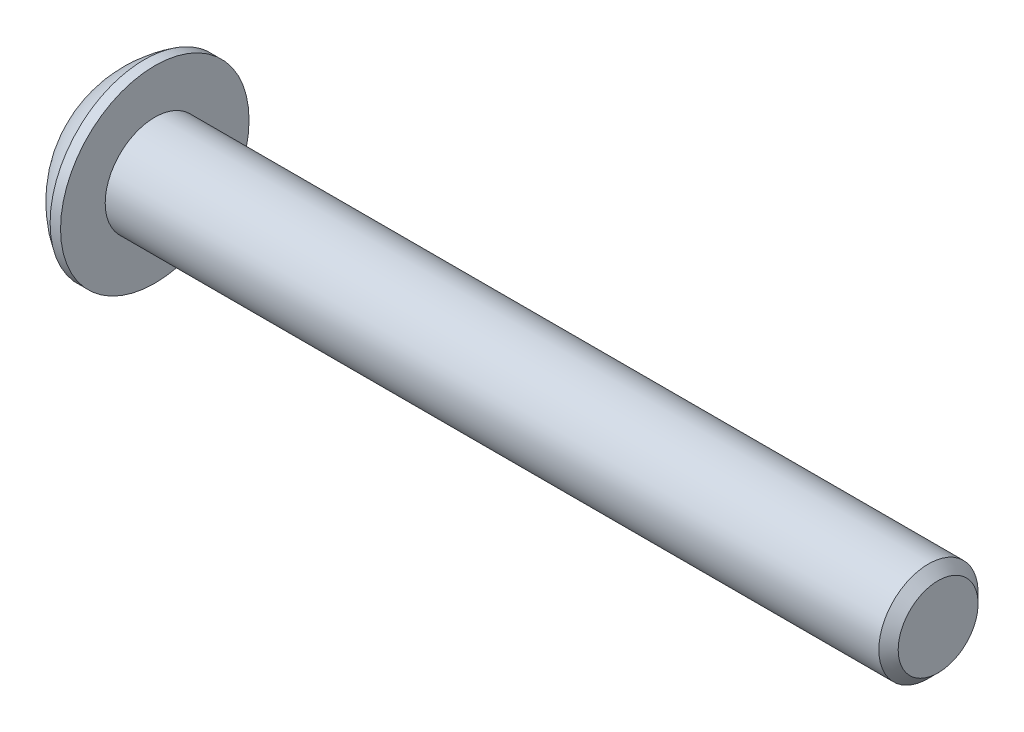
ISO-10303-21;
HEADER;
FILE_DESCRIPTION(('STEP AP214'),'2;1');
FILE_NAME('part.step','',(''),(''),'','','');
FILE_SCHEMA(('AUTOMOTIVE_DESIGN { 1 0 10303 214 1 1 1 1 }'));
ENDSEC;
DATA;
#1=APPLICATION_CONTEXT('core data for automotive mechanical design processes');
#2=APPLICATION_PROTOCOL_DEFINITION('international standard','automotive_design',2000,#1);
#3=PRODUCT_CONTEXT('',#1,'mechanical');
#4=PRODUCT('Part','Part','',(#3));
#5=PRODUCT_RELATED_PRODUCT_CATEGORY('part','',(#4));
#6=PRODUCT_DEFINITION_FORMATION('','',#4);
#7=PRODUCT_DEFINITION_CONTEXT('part definition',#1,'design');
#8=PRODUCT_DEFINITION('design','',#6,#7);
#9=PRODUCT_DEFINITION_SHAPE('','',#8);
#10=(LENGTH_UNIT() NAMED_UNIT(*) SI_UNIT(.MILLI.,.METRE.));
#11=(NAMED_UNIT(*) PLANE_ANGLE_UNIT() SI_UNIT($,.RADIAN.));
#12=(NAMED_UNIT(*) SI_UNIT($,.STERADIAN.) SOLID_ANGLE_UNIT());
#13=UNCERTAINTY_MEASURE_WITH_UNIT(LENGTH_MEASURE(1.E-05),#10,'distance_accuracy_value','');
#14=(GEOMETRIC_REPRESENTATION_CONTEXT(3) GLOBAL_UNCERTAINTY_ASSIGNED_CONTEXT((#13)) GLOBAL_UNIT_ASSIGNED_CONTEXT((#10,
#11,#12)) REPRESENTATION_CONTEXT('',''));
#15=CARTESIAN_POINT('',(0.,0.,0.));
#16=DIRECTION('',(0.,0.,1.));
#17=DIRECTION('',(1.,0.,0.));
#18=AXIS2_PLACEMENT_3D('',#15,#16,#17);
#19=CARTESIAN_POINT('',(1.77800000000017,0.,0.));
#20=DIRECTION('',(-1.,0.,0.));
#21=DIRECTION('',(0.,0.,1.));
#22=AXIS2_PLACEMENT_3D('',#19,#20,#21);
#23=CONICAL_SURFACE('',#22,1.58749999999985,1.04719755119662);
#24=CARTESIAN_POINT('',(2.69454355233856,0.,0.));
#25=VERTEX_POINT('',#24);
#26=VERTEX_LOOP('',#25);
#27=FACE_BOUND('',#26,.T.);
#28=CARTESIAN_POINT('',(1.77800000000017,0.,0.));
#29=DIRECTION('',(-1.,0.,0.));
#30=DIRECTION('',(0.,0.,1.));
#31=AXIS2_PLACEMENT_3D('',#28,#29,#30);
#32=CIRCLE('',#31,1.58749999999985);
#33=CARTESIAN_POINT('',(1.77800000000008,0.,1.58749999999993));
#34=VERTEX_POINT('',#33);
#35=CARTESIAN_POINT('',(1.77800000000008,-1.37481532850773,0.793749999999963));
#36=VERTEX_POINT('',#35);
#37=EDGE_CURVE('E20',#34,#36,#32,.F.);
#38=ORIENTED_EDGE('',*,*,#37,.F.);
#39=CARTESIAN_POINT('',(1.77800000000017,0.,0.));
#40=DIRECTION('',(-1.,0.,0.));
#41=DIRECTION('',(0.,0.,1.));
#42=AXIS2_PLACEMENT_3D('',#39,#40,#41);
#43=CIRCLE('',#42,1.58749999999985);
#44=CARTESIAN_POINT('',(1.77800000000008,1.37481532850773,0.793749999999963));
#45=VERTEX_POINT('',#44);
#46=EDGE_CURVE('E90',#45,#34,#43,.F.);
#47=ORIENTED_EDGE('',*,*,#46,.F.);
#48=CARTESIAN_POINT('',(1.77800000000017,0.,0.));
#49=DIRECTION('',(-1.,0.,0.));
#50=DIRECTION('',(0.,0.,1.));
#51=AXIS2_PLACEMENT_3D('',#48,#49,#50);
#52=CIRCLE('',#51,1.58749999999985);
#53=CARTESIAN_POINT('',(1.77800000000008,1.37481532850773,-0.793749999999964));
#54=VERTEX_POINT('',#53);
#55=EDGE_CURVE('E106',#54,#45,#52,.F.);
#56=ORIENTED_EDGE('',*,*,#55,.F.);
#57=CARTESIAN_POINT('',(1.77800000000017,0.,0.));
#58=DIRECTION('',(-1.,0.,0.));
#59=DIRECTION('',(0.,0.,1.));
#60=AXIS2_PLACEMENT_3D('',#57,#58,#59);
#61=CIRCLE('',#60,1.58749999999985);
#62=CARTESIAN_POINT('',(1.77800000000008,2.13833679173112E-12,-1.58749999999993));
#63=VERTEX_POINT('',#62);
#64=EDGE_CURVE('E445',#63,#54,#61,.F.);
#65=ORIENTED_EDGE('',*,*,#64,.F.);
#66=CARTESIAN_POINT('',(1.77800000000017,0.,0.));
#67=DIRECTION('',(-1.,0.,0.));
#68=DIRECTION('',(0.,0.,1.));
#69=AXIS2_PLACEMENT_3D('',#66,#67,#68);
#70=CIRCLE('',#69,1.58749999999985);
#71=CARTESIAN_POINT('',(1.77800000000008,-1.37481532850773,-0.793749999999964));
#72=VERTEX_POINT('',#71);
#73=EDGE_CURVE('E447',#72,#63,#70,.F.);
#74=ORIENTED_EDGE('',*,*,#73,.F.);
#75=CARTESIAN_POINT('',(1.77800000000017,0.,0.));
#76=DIRECTION('',(-1.,0.,0.));
#77=DIRECTION('',(0.,0.,1.));
#78=AXIS2_PLACEMENT_3D('',#75,#76,#77);
#79=CIRCLE('',#78,1.58749999999985);
#80=EDGE_CURVE('E93',#36,#72,#79,.F.);
#81=ORIENTED_EDGE('',*,*,#80,.F.);
#82=EDGE_LOOP('',(#38,#47,#56,#65,#74,#81));
#83=FACE_BOUND('',#82,.T.);
#84=ADVANCED_FACE('F17',(#27,#83),#23,.F.);
#85=CARTESIAN_POINT('',(1.778,0.,3.175));
#86=DIRECTION('',(-1.,0.,0.));
#87=DIRECTION('',(0.,0.,1.));
#88=AXIS2_PLACEMENT_3D('',#85,#86,#87);
#89=PLANE('',#88);
#90=DIRECTION('',(0.,1.,0.));
#91=VECTOR('',#90,1.);
#92=CARTESIAN_POINT('',(1.778,-0.91654355233853,1.5875));
#93=LINE('',#92,#91);
#94=CARTESIAN_POINT('',(1.778,-0.916543552338529,1.5875));
#95=VERTEX_POINT('',#94);
#96=EDGE_CURVE('E109',#34,#95,#93,.F.);
#97=ORIENTED_EDGE('',*,*,#96,.F.);
#98=ORIENTED_EDGE('',*,*,#37,.T.);
#99=DIRECTION('',(0.,0.5,0.866025403784439));
#100=VECTOR('',#99,1.);
#101=CARTESIAN_POINT('',(1.778,-1.83308710467706,0.));
#102=LINE('',#101,#100);
#103=EDGE_CURVE('E111',#95,#36,#102,.F.);
#104=ORIENTED_EDGE('',*,*,#103,.F.);
#105=EDGE_LOOP('',(#97,#98,#104));
#106=FACE_BOUND('',#105,.T.);
#107=ADVANCED_FACE('F110',(#106),#89,.T.);
#108=CARTESIAN_POINT('',(1.778,0.,3.175));
#109=DIRECTION('',(-1.,0.,0.));
#110=DIRECTION('',(0.,0.,1.));
#111=AXIS2_PLACEMENT_3D('',#108,#109,#110);
#112=PLANE('',#111);
#113=DIRECTION('',(0.,0.5,0.866025403784439));
#114=VECTOR('',#113,1.);
#115=CARTESIAN_POINT('',(1.778,-1.83308710467706,0.));
#116=LINE('',#115,#114);
#117=CARTESIAN_POINT('',(1.778,-1.83308710467706,0.));
#118=VERTEX_POINT('',#117);
#119=EDGE_CURVE('E171',#36,#118,#116,.F.);
#120=ORIENTED_EDGE('',*,*,#119,.F.);
#121=ORIENTED_EDGE('',*,*,#80,.T.);
#122=DIRECTION('',(0.,-0.5,0.866025403784439));
#123=VECTOR('',#122,1.);
#124=CARTESIAN_POINT('',(1.778,-0.91654355233853,-1.5875));
#125=LINE('',#124,#123);
#126=EDGE_CURVE('E159',#118,#72,#125,.F.);
#127=ORIENTED_EDGE('',*,*,#126,.F.);
#128=EDGE_LOOP('',(#120,#121,#127));
#129=FACE_BOUND('',#128,.T.);
#130=ADVANCED_FACE('F249',(#129),#112,.T.);
#131=CARTESIAN_POINT('',(1.778,0.,3.175));
#132=DIRECTION('',(-1.,0.,0.));
#133=DIRECTION('',(0.,0.,1.));
#134=AXIS2_PLACEMENT_3D('',#131,#132,#133);
#135=PLANE('',#134);
#136=DIRECTION('',(0.,-0.5,0.866025403784439));
#137=VECTOR('',#136,1.);
#138=CARTESIAN_POINT('',(1.778,-0.91654355233853,-1.5875));
#139=LINE('',#138,#137);
#140=CARTESIAN_POINT('',(1.778,-0.91654355233853,-1.5875));
#141=VERTEX_POINT('',#140);
#142=EDGE_CURVE('E156',#72,#141,#139,.F.);
#143=ORIENTED_EDGE('',*,*,#142,.F.);
#144=ORIENTED_EDGE('',*,*,#73,.T.);
#145=DIRECTION('',(0.,1.,0.));
#146=VECTOR('',#145,1.);
#147=CARTESIAN_POINT('',(1.778,0.916543552338532,-1.5875));
#148=LINE('',#147,#146);
#149=EDGE_CURVE('E143',#141,#63,#148,.T.);
#150=ORIENTED_EDGE('',*,*,#149,.F.);
#151=EDGE_LOOP('',(#143,#144,#150));
#152=FACE_BOUND('',#151,.T.);
#153=ADVANCED_FACE('F245',(#152),#135,.T.);
#154=CARTESIAN_POINT('',(1.778,0.,3.175));
#155=DIRECTION('',(-1.,0.,0.));
#156=DIRECTION('',(0.,0.,1.));
#157=AXIS2_PLACEMENT_3D('',#154,#155,#156);
#158=PLANE('',#157);
#159=DIRECTION('',(0.,1.,0.));
#160=VECTOR('',#159,1.);
#161=CARTESIAN_POINT('',(1.778,0.916543552338532,-1.5875));
#162=LINE('',#161,#160);
#163=CARTESIAN_POINT('',(1.778,0.916543552338532,-1.5875));
#164=VERTEX_POINT('',#163);
#165=EDGE_CURVE('E140',#63,#164,#162,.T.);
#166=ORIENTED_EDGE('',*,*,#165,.F.);
#167=ORIENTED_EDGE('',*,*,#64,.T.);
#168=DIRECTION('',(0.,-0.5,-0.866025403784439));
#169=VECTOR('',#168,1.);
#170=CARTESIAN_POINT('',(1.778,1.83308710467706,0.));
#171=LINE('',#170,#169);
#172=EDGE_CURVE('E128',#164,#54,#171,.F.);
#173=ORIENTED_EDGE('',*,*,#172,.F.);
#174=EDGE_LOOP('',(#166,#167,#173));
#175=FACE_BOUND('',#174,.T.);
#176=ADVANCED_FACE('F241',(#175),#158,.T.);
#177=CARTESIAN_POINT('',(1.778,0.,3.175));
#178=DIRECTION('',(-1.,0.,0.));
#179=DIRECTION('',(0.,0.,1.));
#180=AXIS2_PLACEMENT_3D('',#177,#178,#179);
#181=PLANE('',#180);
#182=DIRECTION('',(0.,-0.5,-0.866025403784439));
#183=VECTOR('',#182,1.);
#184=CARTESIAN_POINT('',(1.778,1.83308710467706,0.));
#185=LINE('',#184,#183);
#186=CARTESIAN_POINT('',(1.778,1.83308710467706,0.));
#187=VERTEX_POINT('',#186);
#188=EDGE_CURVE('E125',#54,#187,#185,.F.);
#189=ORIENTED_EDGE('',*,*,#188,.F.);
#190=ORIENTED_EDGE('',*,*,#55,.T.);
#191=DIRECTION('',(0.,0.5,-0.866025403784439));
#192=VECTOR('',#191,1.);
#193=CARTESIAN_POINT('',(1.778,0.916543552338532,1.5875));
#194=LINE('',#193,#192);
#195=EDGE_CURVE('E148',#187,#45,#194,.F.);
#196=ORIENTED_EDGE('',*,*,#195,.F.);
#197=EDGE_LOOP('',(#189,#190,#196));
#198=FACE_BOUND('',#197,.T.);
#199=ADVANCED_FACE('F238',(#198),#181,.T.);
#200=CARTESIAN_POINT('',(1.778,0.,3.175));
#201=DIRECTION('',(-1.,0.,0.));
#202=DIRECTION('',(0.,0.,1.));
#203=AXIS2_PLACEMENT_3D('',#200,#201,#202);
#204=PLANE('',#203);
#205=DIRECTION('',(0.,0.5,-0.866025403784439));
#206=VECTOR('',#205,1.);
#207=CARTESIAN_POINT('',(1.778,0.916543552338532,1.5875));
#208=LINE('',#207,#206);
#209=CARTESIAN_POINT('',(1.778,0.916543552338532,1.5875));
#210=VERTEX_POINT('',#209);
#211=EDGE_CURVE('E104',#45,#210,#208,.F.);
#212=ORIENTED_EDGE('',*,*,#211,.F.);
#213=ORIENTED_EDGE('',*,*,#46,.T.);
#214=DIRECTION('',(0.,1.,0.));
#215=VECTOR('',#214,1.);
#216=CARTESIAN_POINT('',(1.778,-0.91654355233853,1.5875));
#217=LINE('',#216,#215);
#218=EDGE_CURVE('E101',#210,#34,#217,.F.);
#219=ORIENTED_EDGE('',*,*,#218,.F.);
#220=EDGE_LOOP('',(#212,#213,#219));
#221=FACE_BOUND('',#220,.T.);
#222=ADVANCED_FACE('F99',(#221),#204,.T.);
#223=CARTESIAN_POINT('',(1.778,-0.91654355233853,1.5875));
#224=DIRECTION('',(0.,0.,-1.));
#225=DIRECTION('',(0.,1.,0.));
#226=AXIS2_PLACEMENT_3D('',#223,#224,#225);
#227=PLANE('',#226);
#228=DIRECTION('',(0.,1.,0.));
#229=VECTOR('',#228,1.);
#230=CARTESIAN_POINT('',(0.,0.,1.5875));
#231=LINE('',#230,#229);
#232=CARTESIAN_POINT('',(0.,0.916543552338532,1.5875));
#233=VERTEX_POINT('',#232);
#234=CARTESIAN_POINT('',(0.,-0.91654355233853,1.5875));
#235=VERTEX_POINT('',#234);
#236=EDGE_CURVE('E132',#233,#235,#231,.F.);
#237=ORIENTED_EDGE('',*,*,#236,.F.);
#238=DIRECTION('',(1.,0.,0.));
#239=VECTOR('',#238,1.);
#240=CARTESIAN_POINT('',(1.778,0.916543552338532,1.5875));
#241=LINE('',#240,#239);
#242=EDGE_CURVE('E117',#210,#233,#241,.F.);
#243=ORIENTED_EDGE('',*,*,#242,.F.);
#244=ORIENTED_EDGE('',*,*,#218,.T.);
#245=ORIENTED_EDGE('',*,*,#96,.T.);
#246=DIRECTION('',(1.,0.,0.));
#247=VECTOR('',#246,1.);
#248=CARTESIAN_POINT('',(1.778,-0.916543552338529,1.5875));
#249=LINE('',#248,#247);
#250=EDGE_CURVE('E168',#235,#95,#249,.T.);
#251=ORIENTED_EDGE('',*,*,#250,.F.);
#252=EDGE_LOOP('',(#237,#243,#244,#245,#251));
#253=FACE_BOUND('',#252,.T.);
#254=ADVANCED_FACE('F115',(#253),#227,.T.);
#255=CARTESIAN_POINT('',(1.778,-1.83308710467706,0.));
#256=DIRECTION('',(0.,0.866025403784439,-0.5));
#257=DIRECTION('',(0.,0.5,0.866025403784439));
#258=AXIS2_PLACEMENT_3D('',#255,#256,#257);
#259=PLANE('',#258);
#260=DIRECTION('',(0.,-0.5,-0.866025403784439));
#261=VECTOR('',#260,1.);
#262=CARTESIAN_POINT('',(0.,-0.91654355233853,1.5875));
#263=LINE('',#262,#261);
#264=CARTESIAN_POINT('',(0.,-1.83308710467706,0.));
#265=VERTEX_POINT('',#264);
#266=EDGE_CURVE('E431',#235,#265,#263,.T.);
#267=ORIENTED_EDGE('',*,*,#266,.F.);
#268=ORIENTED_EDGE('',*,*,#250,.T.);
#269=ORIENTED_EDGE('',*,*,#103,.T.);
#270=ORIENTED_EDGE('',*,*,#119,.T.);
#271=DIRECTION('',(1.,0.,0.));
#272=VECTOR('',#271,1.);
#273=CARTESIAN_POINT('',(1.778,-1.83308710467706,0.));
#274=LINE('',#273,#272);
#275=EDGE_CURVE('E153',#265,#118,#274,.T.);
#276=ORIENTED_EDGE('',*,*,#275,.F.);
#277=EDGE_LOOP('',(#267,#268,#269,#270,#276));
#278=FACE_BOUND('',#277,.T.);
#279=ADVANCED_FACE('F229',(#278),#259,.T.);
#280=CARTESIAN_POINT('',(1.778,-0.91654355233853,-1.5875));
#281=DIRECTION('',(0.,0.866025403784439,0.5));
#282=DIRECTION('',(0.,-0.5,0.866025403784439));
#283=AXIS2_PLACEMENT_3D('',#280,#281,#282);
#284=PLANE('',#283);
#285=DIRECTION('',(0.,0.5,-0.866025403784439));
#286=VECTOR('',#285,1.);
#287=CARTESIAN_POINT('',(0.,-1.83308710467706,0.));
#288=LINE('',#287,#286);
#289=CARTESIAN_POINT('',(0.,-0.91654355233853,-1.5875));
#290=VERTEX_POINT('',#289);
#291=EDGE_CURVE('E428',#265,#290,#288,.T.);
#292=ORIENTED_EDGE('',*,*,#291,.F.);
#293=ORIENTED_EDGE('',*,*,#275,.T.);
#294=ORIENTED_EDGE('',*,*,#126,.T.);
#295=ORIENTED_EDGE('',*,*,#142,.T.);
#296=DIRECTION('',(1.,0.,0.));
#297=VECTOR('',#296,1.);
#298=CARTESIAN_POINT('',(1.778,-0.91654355233853,-1.5875));
#299=LINE('',#298,#297);
#300=EDGE_CURVE('E137',#290,#141,#299,.T.);
#301=ORIENTED_EDGE('',*,*,#300,.F.);
#302=EDGE_LOOP('',(#292,#293,#294,#295,#301));
#303=FACE_BOUND('',#302,.T.);
#304=ADVANCED_FACE('F225',(#303),#284,.T.);
#305=CARTESIAN_POINT('',(1.778,0.916543552338532,-1.5875));
#306=DIRECTION('',(0.,0.,1.));
#307=DIRECTION('',(1.,0.,0.));
#308=AXIS2_PLACEMENT_3D('',#305,#306,#307);
#309=PLANE('',#308);
#310=DIRECTION('',(0.,1.,0.));
#311=VECTOR('',#310,1.);
#312=CARTESIAN_POINT('',(0.,0.,-1.5875));
#313=LINE('',#312,#311);
#314=CARTESIAN_POINT('',(0.,0.916543552338532,-1.5875));
#315=VERTEX_POINT('',#314);
#316=EDGE_CURVE('E425',#290,#315,#313,.T.);
#317=ORIENTED_EDGE('',*,*,#316,.F.);
#318=ORIENTED_EDGE('',*,*,#300,.T.);
#319=ORIENTED_EDGE('',*,*,#149,.T.);
#320=ORIENTED_EDGE('',*,*,#165,.T.);
#321=DIRECTION('',(1.,0.,0.));
#322=VECTOR('',#321,1.);
#323=CARTESIAN_POINT('',(1.778,0.916543552338532,-1.5875));
#324=LINE('',#323,#322);
#325=EDGE_CURVE('E127',#315,#164,#324,.T.);
#326=ORIENTED_EDGE('',*,*,#325,.F.);
#327=EDGE_LOOP('',(#317,#318,#319,#320,#326));
#328=FACE_BOUND('',#327,.T.);
#329=ADVANCED_FACE('F222',(#328),#309,.T.);
#330=CARTESIAN_POINT('',(1.778,1.83308710467706,0.));
#331=DIRECTION('',(0.,-0.866025403784439,0.5));
#332=DIRECTION('',(0.,-0.5,-0.866025403784439));
#333=AXIS2_PLACEMENT_3D('',#330,#331,#332);
#334=PLANE('',#333);
#335=DIRECTION('',(0.,0.5,0.866025403784439));
#336=VECTOR('',#335,1.);
#337=CARTESIAN_POINT('',(0.,0.916543552338532,-1.5875));
#338=LINE('',#337,#336);
#339=CARTESIAN_POINT('',(0.,1.83308710467706,0.));
#340=VERTEX_POINT('',#339);
#341=EDGE_CURVE('E422',#315,#340,#338,.T.);
#342=ORIENTED_EDGE('',*,*,#341,.F.);
#343=ORIENTED_EDGE('',*,*,#325,.T.);
#344=ORIENTED_EDGE('',*,*,#172,.T.);
#345=ORIENTED_EDGE('',*,*,#188,.T.);
#346=DIRECTION('',(1.,0.,0.));
#347=VECTOR('',#346,1.);
#348=CARTESIAN_POINT('',(1.778,1.83308710467706,0.));
#349=LINE('',#348,#347);
#350=EDGE_CURVE('E35',#340,#187,#349,.T.);
#351=ORIENTED_EDGE('',*,*,#350,.F.);
#352=EDGE_LOOP('',(#342,#343,#344,#345,#351));
#353=FACE_BOUND('',#352,.T.);
#354=ADVANCED_FACE('F218',(#353),#334,.T.);
#355=CARTESIAN_POINT('',(1.778,0.916543552338532,1.5875));
#356=DIRECTION('',(0.,-0.866025403784439,-0.5));
#357=DIRECTION('',(0.,0.5,-0.866025403784439));
#358=AXIS2_PLACEMENT_3D('',#355,#356,#357);
#359=PLANE('',#358);
#360=DIRECTION('',(0.,-0.5,0.866025403784439));
#361=VECTOR('',#360,1.);
#362=CARTESIAN_POINT('',(0.,1.83308710467706,0.));
#363=LINE('',#362,#361);
#364=EDGE_CURVE('E204',#340,#233,#363,.T.);
#365=ORIENTED_EDGE('',*,*,#364,.F.);
#366=ORIENTED_EDGE('',*,*,#350,.T.);
#367=ORIENTED_EDGE('',*,*,#195,.T.);
#368=ORIENTED_EDGE('',*,*,#211,.T.);
#369=ORIENTED_EDGE('',*,*,#242,.T.);
#370=EDGE_LOOP('',(#365,#366,#367,#368,#369));
#371=FACE_BOUND('',#370,.T.);
#372=ADVANCED_FACE('F214',(#371),#359,.T.);
#373=CARTESIAN_POINT('',(0.,0.,0.));
#374=DIRECTION('',(-1.,0.,0.));
#375=DIRECTION('',(0.,0.,1.));
#376=AXIS2_PLACEMENT_3D('',#373,#374,#375);
#377=PLANE('',#376);
#378=ORIENTED_EDGE('',*,*,#341,.T.);
#379=ORIENTED_EDGE('',*,*,#364,.T.);
#380=ORIENTED_EDGE('',*,*,#236,.T.);
#381=ORIENTED_EDGE('',*,*,#266,.T.);
#382=ORIENTED_EDGE('',*,*,#291,.T.);
#383=ORIENTED_EDGE('',*,*,#316,.T.);
#384=EDGE_LOOP('',(#378,#379,#380,#381,#382,#383));
#385=FACE_BOUND('',#384,.T.);
#386=CARTESIAN_POINT('',(0.,2.29235,0.));
#387=CARTESIAN_POINT('',(0.,2.29234961429956,0.0643619991867157));
#388=CARTESIAN_POINT('',(0.,2.28963695190107,0.128735826629365));
#389=CARTESIAN_POINT('',(0.,2.27880393843647,0.257038618985286));
#390=CARTESIAN_POINT('',(0.,2.27068199085126,0.320967446929162));
#391=CARTESIAN_POINT('',(0.,2.24906694794255,0.448021254607717));
#392=CARTESIAN_POINT('',(-2.11340525001748E-13,2.2355653265346,0.51114479338186));
#393=CARTESIAN_POINT('',(2.11512386713829E-13,2.20328400495644,0.63606517614932));
#394=CARTESIAN_POINT('',(7.89777647889285E-13,2.18450002159113,0.697860899533934));
#395=CARTESIAN_POINT('',(1.31313055153497E-12,2.12048422735802,0.880329802927747));
#396=CARTESIAN_POINT('',(0.,2.06753599079458,0.998391795928115));
#397=CARTESIAN_POINT('',(0.,1.94254204858672,1.22393765942147));
#398=CARTESIAN_POINT('',(1.09204378065915E-12,1.87049561696642,1.33142112758207));
#399=CARTESIAN_POINT('',(6.76776854490196E-13,1.7497425419488,1.48237719670935));
#400=CARTESIAN_POINT('',(1.81284253823873E-13,1.707345731323,1.53101280076738));
#401=CARTESIAN_POINT('',(-1.81109468498991E-13,1.61863910291529,1.62450601319185));
#402=CARTESIAN_POINT('',(0.,1.57233309727312,1.66936721890417));
#403=CARTESIAN_POINT('',(0.,1.47608431707233,1.7550488420402));
#404=CARTESIAN_POINT('',(0.,1.42613990458994,1.79586741981511));
#405=CARTESIAN_POINT('',(0.,1.3229945254125,1.87315615311522));
#406=CARTESIAN_POINT('',(0.,1.26979280714187,1.90962529930696));
#407=CARTESIAN_POINT('',(0.,1.10588180153952,2.01207722151089));
#408=CARTESIAN_POINT('',(0.,0.990764947001304,2.07119486286666));
#409=CARTESIAN_POINT('',(0.,0.752302198839712,2.16922858468855));
#410=CARTESIAN_POINT('',(0.,0.628956393121256,2.20814488091449));
#411=CARTESIAN_POINT('',(0.,0.377466101733267,2.2647275576592));
#412=CARTESIAN_POINT('',(0.,0.249321590440378,2.28239382469378));
#413=CARTESIAN_POINT('',(0.,-0.0081143537161095,2.29595665980954));
#414=CARTESIAN_POINT('',(0.,-0.137405786579707,2.29185322789072));
#415=CARTESIAN_POINT('',(0.,-0.393449386933727,2.26200962409059));
#416=CARTESIAN_POINT('',(0.,-0.520201567981084,2.23626956775765));
#417=CARTESIAN_POINT('',(0.,-0.767645294384451,2.16383549332686));
#418=CARTESIAN_POINT('',(0.,-0.888336774993557,2.11714125142685));
#419=CARTESIAN_POINT('',(0.,-1.06210572146656,2.03247976453653));
#420=CARTESIAN_POINT('',(0.,-1.11884498714067,2.00180278323695));
#421=CARTESIAN_POINT('',(0.,-1.22954062855573,1.93578011658035));
#422=CARTESIAN_POINT('',(0.,-1.28349764565392,1.90043551394249));
#423=CARTESIAN_POINT('',(0.,-1.38821676641537,1.82534174602347));
#424=CARTESIAN_POINT('',(0.,-1.43898030563029,1.78559458231503));
#425=CARTESIAN_POINT('',(0.,-1.53701984534431,1.70193996292361));
#426=CARTESIAN_POINT('',(0.,-1.58429243280551,1.65802852924126));
#427=CARTESIAN_POINT('',(0.,-1.72023903553758,1.52059650554138));
#428=CARTESIAN_POINT('',(0.,-1.80318066138239,1.42127847626519));
#429=CARTESIAN_POINT('',(0.,-1.95118232345098,1.21011519784664));
#430=CARTESIAN_POINT('',(0.,-2.01624303935584,1.09827042509272));
#431=CARTESIAN_POINT('',(0.,-2.09907772661315,0.923538238005833));
#432=CARTESIAN_POINT('',(0.,-2.12425103063559,0.864058373981962));
#433=CARTESIAN_POINT('',(0.,-2.16947990046566,0.743221562175597));
#434=CARTESIAN_POINT('',(0.,-2.18953960800684,0.681866178863361));
#435=CARTESIAN_POINT('',(0.,-2.22438542051156,0.557786972400353));
#436=CARTESIAN_POINT('',(0.,-2.23917985294818,0.495065478128169));
#437=CARTESIAN_POINT('',(0.,-2.26343456384454,0.368611258323513));
#438=CARTESIAN_POINT('',(0.,-2.27289641559286,0.304878836759567));
#439=CARTESIAN_POINT('',(0.,-2.28388649696737,0.200873029360623));
#440=CARTESIAN_POINT('',(0.,-2.28705930623294,0.160766164180097));
#441=CARTESIAN_POINT('',(0.,-2.29129117827044,0.0804410725432708));
#442=CARTESIAN_POINT('',(0.,-2.29235024104238,0.0402228460869714));
#443=CARTESIAN_POINT('',(0.,-2.29234961429956,-0.0643619991867167));
#444=CARTESIAN_POINT('',(0.,-2.28963695190108,-0.128735826629366));
#445=CARTESIAN_POINT('',(0.,-2.27880393843648,-0.257038618985287));
#446=CARTESIAN_POINT('',(0.,-2.27068199085126,-0.320967446929162));
#447=CARTESIAN_POINT('',(0.,-2.24906694794255,-0.448021254607717));
#448=CARTESIAN_POINT('',(-2.10985734619542E-13,-2.2355653265346,-0.51114479338186));
#449=CARTESIAN_POINT('',(2.11157307816761E-13,-2.20328400495644,-0.63606517614932));
#450=CARTESIAN_POINT('',(7.88465621793312E-13,-2.18450002159113,-0.697860899533933));
#451=CARTESIAN_POINT('',(1.31055244824746E-12,-2.12048422735802,-0.880329802927746));
#452=CARTESIAN_POINT('',(0.,-2.06753599079458,-0.998391795928112));
#453=CARTESIAN_POINT('',(0.,-1.94254204858673,-1.22393765942147));
#454=CARTESIAN_POINT('',(1.09464441069229E-12,-1.87049561696643,-1.33142112758208));
#455=CARTESIAN_POINT('',(6.78078057357048E-13,-1.74974254194881,-1.48237719670935));
#456=CARTESIAN_POINT('',(1.81607554979966E-13,-1.70734573132301,-1.53101280076737));
#457=CARTESIAN_POINT('',(-1.81432457944076E-13,-1.61863910291529,-1.62450601319185));
#458=CARTESIAN_POINT('',(0.,-1.57233309727312,-1.66936721890417));
#459=CARTESIAN_POINT('',(0.,-1.47608431707233,-1.7550488420402));
#460=CARTESIAN_POINT('',(0.,-1.42613990458994,-1.79586741981511));
#461=CARTESIAN_POINT('',(0.,-1.32299452541251,-1.87315615311522));
#462=CARTESIAN_POINT('',(0.,-1.26979280714187,-1.90962529930696));
#463=CARTESIAN_POINT('',(0.,-1.10588180153952,-2.01207722151089));
#464=CARTESIAN_POINT('',(0.,-0.990764947001309,-2.07119486286666));
#465=CARTESIAN_POINT('',(0.,-0.752302198839716,-2.16922858468855));
#466=CARTESIAN_POINT('',(0.,-0.628956393121262,-2.20814488091449));
#467=CARTESIAN_POINT('',(0.,-0.377466101733273,-2.2647275576592));
#468=CARTESIAN_POINT('',(0.,-0.249321590440383,-2.28239382469378));
#469=CARTESIAN_POINT('',(0.,0.00811435371610491,-2.29595665980954));
#470=CARTESIAN_POINT('',(0.,0.137405786579702,-2.29185322789072));
#471=CARTESIAN_POINT('',(0.,0.393449386933723,-2.26200962409059));
#472=CARTESIAN_POINT('',(0.,0.52020156798108,-2.23626956775766));
#473=CARTESIAN_POINT('',(0.,0.767645294384448,-2.16383549332687));
#474=CARTESIAN_POINT('',(0.,0.888336774993553,-2.11714125142685));
#475=CARTESIAN_POINT('',(0.,1.06210572146656,-2.03247976453653));
#476=CARTESIAN_POINT('',(0.,1.11884498714066,-2.00180278323695));
#477=CARTESIAN_POINT('',(0.,1.22954062855572,-1.93578011658035));
#478=CARTESIAN_POINT('',(0.,1.28349764565392,-1.9004355139425));
#479=CARTESIAN_POINT('',(0.,1.38821676641537,-1.82534174602348));
#480=CARTESIAN_POINT('',(0.,1.43898030563028,-1.78559458231503));
#481=CARTESIAN_POINT('',(0.,1.53701984534431,-1.70193996292361));
#482=CARTESIAN_POINT('',(0.,1.5842924328055,-1.65802852924126));
#483=CARTESIAN_POINT('',(0.,1.72023903553758,-1.52059650554138));
#484=CARTESIAN_POINT('',(0.,1.80318066138238,-1.42127847626519));
#485=CARTESIAN_POINT('',(0.,1.95118232345098,-1.21011519784664));
#486=CARTESIAN_POINT('',(0.,2.01624303935584,-1.09827042509272));
#487=CARTESIAN_POINT('',(0.,2.09907772661315,-0.923538238005836));
#488=CARTESIAN_POINT('',(0.,2.12425103063558,-0.864058373981964));
#489=CARTESIAN_POINT('',(0.,2.16947990046565,-0.743221562175599));
#490=CARTESIAN_POINT('',(0.,2.18953960800684,-0.681866178863364));
#491=CARTESIAN_POINT('',(0.,2.22438542051156,-0.557786972400356));
#492=CARTESIAN_POINT('',(0.,2.23917985294818,-0.495065478128172));
#493=CARTESIAN_POINT('',(0.,2.26343456384453,-0.368611258323515));
#494=CARTESIAN_POINT('',(0.,2.27289641559285,-0.304878836759569));
#495=CARTESIAN_POINT('',(0.,2.28388649696736,-0.200873029360625));
#496=CARTESIAN_POINT('',(0.,2.28705930623294,-0.160766164180098));
#497=CARTESIAN_POINT('',(0.,2.29129117827044,-0.0804410725432722));
#498=CARTESIAN_POINT('',(0.,2.29235024104238,-0.0402228460869726));
#499=CARTESIAN_POINT('',(0.,2.29235,0.));
#500=B_SPLINE_CURVE_WITH_KNOTS('',3,(#386,#387,#388,#389,#390,#391,#392,#393,#394,#395,#396,
#397,#398,#399,#400,#401,#402,#403,#404,#405,#406,#407,#408,#409,#410,#411,#412,#413,#414,#415,
#416,#417,#418,#419,#420,#421,#422,#423,#424,#425,#426,#427,#428,#429,#430,#431,#432,#433,#434,
#435,#436,#437,#438,#439,#440,#441,#442,#443,#444,#445,#446,#447,#448,#449,#450,#451,#452,#453,
#454,#455,#456,#457,#458,#459,#460,#461,#462,#463,#464,#465,#466,#467,#468,#469,#470,#471,#472,
#473,#474,#475,#476,#477,#478,#479,#480,#481,#482,#483,#484,#485,#486,#487,#488,#489,#490,#491,
#492,#493,#494,#495,#496,#497,#498,#499),.UNSPECIFIED.,.T.,.F.,(4,2,2,2,2,2,2,2,2,2,2,2,2,2,2,2,
2,2,2,2,2,2,2,2,2,2,2,2,2,2,2,2,2,2,2,2,2,2,2,2,2,2,2,2,2,2,2,2,2,2,2,2,2,2,2,2,4),(0.,
0.193048968618033,0.386154939782394,0.579568183995958,0.773138711491038,1.15935703864577,
1.54559004914645,1.73895960916368,1.93214273180063,2.12541336477221,2.31872876140888,
2.70495649282618,3.09118009906582,3.47740576789431,3.86363143672284,4.24985504296253,
4.63608277437978,4.82939817101619,5.02266880398747,5.21585192662419,5.40922148664121,
5.79545449714216,6.18167282429723,6.3752433517926,6.5686565960064,6.76176256717088,
6.95481153578906,7.0754569329192,7.19610233004935,7.38915129866739,7.58225726983175,
7.77567051404531,7.96924104154039,8.35545936869512,8.7416923791958,8.93506193921303,
9.12824506184998,9.32151569482156,9.51483109145823,9.90105882287553,10.2872824291152,
10.6735080979437,11.0597337667722,11.4459573730119,11.8321851044291,12.0255005010655,
12.2187711340368,12.4119542566735,12.6053238166906,12.9915568271915,13.3777751543466,
13.571345681842,13.7647589260558,13.9578648972202,14.1509138658384,14.2715592629686,
14.3922046600987),.UNSPECIFIED.);
#501=CARTESIAN_POINT('',(0.,2.29235,0.));
#502=VERTEX_POINT('',#501);
#503=EDGE_CURVE('E197',#502,#502,#500,.T.);
#504=ORIENTED_EDGE('',*,*,#503,.F.);
#505=EDGE_LOOP('',(#504));
#506=FACE_BOUND('',#505,.T.);
#507=ADVANCED_FACE('F210',(#385,#506),#377,.T.);
#508=CARTESIAN_POINT('',(4.85989606481481,0.,0.));
#509=DIRECTION('',(0.,1.,0.));
#510=DIRECTION('',(1.,0.,0.));
#511=AXIS2_PLACEMENT_3D('',#508,#509,#510);
#512=SPHERICAL_SURFACE('',#511,5.37340285883187);
#513=CARTESIAN_POINT('',(2.0574,0.,0.));
#514=DIRECTION('',(-1.,0.,0.));
#515=DIRECTION('',(0.,0.,1.));
#516=AXIS2_PLACEMENT_3D('',#513,#514,#515);
#517=CIRCLE('',#516,4.5847);
#518=CARTESIAN_POINT('',(2.0574,0.,4.5847));
#519=VERTEX_POINT('',#518);
#520=EDGE_CURVE('E194',#519,#519,#517,.F.);
#521=ORIENTED_EDGE('',*,*,#520,.F.);
#522=EDGE_LOOP('',(#521));
#523=FACE_BOUND('',#522,.T.);
#524=ORIENTED_EDGE('',*,*,#503,.T.);
#525=EDGE_LOOP('',(#524));
#526=FACE_BOUND('',#525,.T.);
#527=ADVANCED_FACE('F206',(#523,#526),#512,.T.);
#528=CARTESIAN_POINT('',(40.6654,0.,0.));
#529=DIRECTION('',(-1.,0.,0.));
#530=DIRECTION('',(0.,0.,1.));
#531=AXIS2_PLACEMENT_3D('',#528,#529,#530);
#532=PLANE('',#531);
#533=CARTESIAN_POINT('',(40.6654000000231,0.,0.));
#534=DIRECTION('',(-1.,0.,0.));
#535=DIRECTION('',(0.,0.,1.));
#536=AXIS2_PLACEMENT_3D('',#533,#534,#535);
#537=CIRCLE('',#536,1.94310000006226);
#538=CARTESIAN_POINT('',(40.6654000000231,0.,1.94310000006226));
#539=VERTEX_POINT('',#538);
#540=EDGE_CURVE('E191',#539,#539,#537,.T.);
#541=ORIENTED_EDGE('',*,*,#540,.F.);
#542=EDGE_LOOP('',(#541));
#543=FACE_BOUND('',#542,.T.);
#544=ADVANCED_FACE('F277',(#543),#532,.F.);
#545=CARTESIAN_POINT('',(0.,0.,0.));
#546=DIRECTION('',(-1.,0.,0.));
#547=DIRECTION('',(0.,0.,1.));
#548=AXIS2_PLACEMENT_3D('',#545,#546,#547);
#549=CYLINDRICAL_SURFACE('',#548,4.5847);
#550=ORIENTED_EDGE('',*,*,#520,.T.);
#551=EDGE_LOOP('',(#550));
#552=FACE_BOUND('',#551,.T.);
#553=CARTESIAN_POINT('',(2.5654,0.,0.));
#554=DIRECTION('',(-1.,0.,0.));
#555=DIRECTION('',(0.,0.,1.));
#556=AXIS2_PLACEMENT_3D('',#553,#554,#555);
#557=CIRCLE('',#556,4.5847);
#558=CARTESIAN_POINT('',(2.5654,0.,4.5847));
#559=VERTEX_POINT('',#558);
#560=EDGE_CURVE('E188',#559,#559,#557,.T.);
#561=ORIENTED_EDGE('',*,*,#560,.T.);
#562=EDGE_LOOP('',(#561));
#563=FACE_BOUND('',#562,.T.);
#564=ADVANCED_FACE('F274',(#552,#563),#549,.T.);
#565=CARTESIAN_POINT('',(40.1955000000385,0.,0.));
#566=DIRECTION('',(-1.,0.,0.));
#567=DIRECTION('',(0.,0.,1.));
#568=AXIS2_PLACEMENT_3D('',#565,#566,#567);
#569=CONICAL_SURFACE('',#568,2.41300000004685,0.785398163397448);
#570=CARTESIAN_POINT('',(40.1955,0.,0.));
#571=DIRECTION('',(-1.,0.,0.));
#572=DIRECTION('',(0.,0.,1.));
#573=AXIS2_PLACEMENT_3D('',#570,#571,#572);
#574=CIRCLE('',#573,2.413);
#575=CARTESIAN_POINT('',(40.1955,0.,2.413));
#576=VERTEX_POINT('',#575);
#577=EDGE_CURVE('E26',#576,#576,#574,.T.);
#578=ORIENTED_EDGE('',*,*,#577,.F.);
#579=EDGE_LOOP('',(#578));
#580=FACE_BOUND('',#579,.T.);
#581=ORIENTED_EDGE('',*,*,#540,.T.);
#582=EDGE_LOOP('',(#581));
#583=FACE_BOUND('',#582,.T.);
#584=ADVANCED_FACE('F267',(#580,#583),#569,.T.);
#585=CARTESIAN_POINT('',(2.5654,2.413,0.));
#586=DIRECTION('',(-1.,0.,0.));
#587=DIRECTION('',(0.,0.,1.));
#588=AXIS2_PLACEMENT_3D('',#585,#586,#587);
#589=PLANE('',#588);
#590=CARTESIAN_POINT('',(2.5654,0.,0.));
#591=DIRECTION('',(-1.,0.,0.));
#592=DIRECTION('',(0.,0.,1.));
#593=AXIS2_PLACEMENT_3D('',#590,#591,#592);
#594=CIRCLE('',#593,2.413);
#595=CARTESIAN_POINT('',(2.5654,0.,2.413));
#596=VERTEX_POINT('',#595);
#597=EDGE_CURVE('E11',#596,#596,#594,.F.);
#598=ORIENTED_EDGE('',*,*,#597,.F.);
#599=EDGE_LOOP('',(#598));
#600=FACE_BOUND('',#599,.T.);
#601=ORIENTED_EDGE('',*,*,#560,.F.);
#602=EDGE_LOOP('',(#601));
#603=FACE_BOUND('',#602,.T.);
#604=ADVANCED_FACE('F261',(#600,#603),#589,.F.);
#605=CARTESIAN_POINT('',(0.,0.,0.));
#606=DIRECTION('',(-1.,0.,0.));
#607=DIRECTION('',(0.,0.,1.));
#608=AXIS2_PLACEMENT_3D('',#605,#606,#607);
#609=CYLINDRICAL_SURFACE('',#608,2.413);
#610=ORIENTED_EDGE('',*,*,#597,.T.);
#611=EDGE_LOOP('',(#610));
#612=FACE_BOUND('',#611,.T.);
#613=ORIENTED_EDGE('',*,*,#577,.T.);
#614=EDGE_LOOP('',(#613));
#615=FACE_BOUND('',#614,.T.);
#616=ADVANCED_FACE('F259',(#612,#615),#609,.T.);
#617=CLOSED_SHELL('',(#84,#107,#130,#153,#176,#199,#222,#254,#279,#304,#329,#354,#372,#507,#527,
#544,#564,#584,#604,#616));
#618=MANIFOLD_SOLID_BREP('B1',#617);
#619=ADVANCED_BREP_SHAPE_REPRESENTATION('',(#18,#618),#14);
#620=SHAPE_DEFINITION_REPRESENTATION(#9,#619);
ENDSEC;
END-ISO-10303-21;
